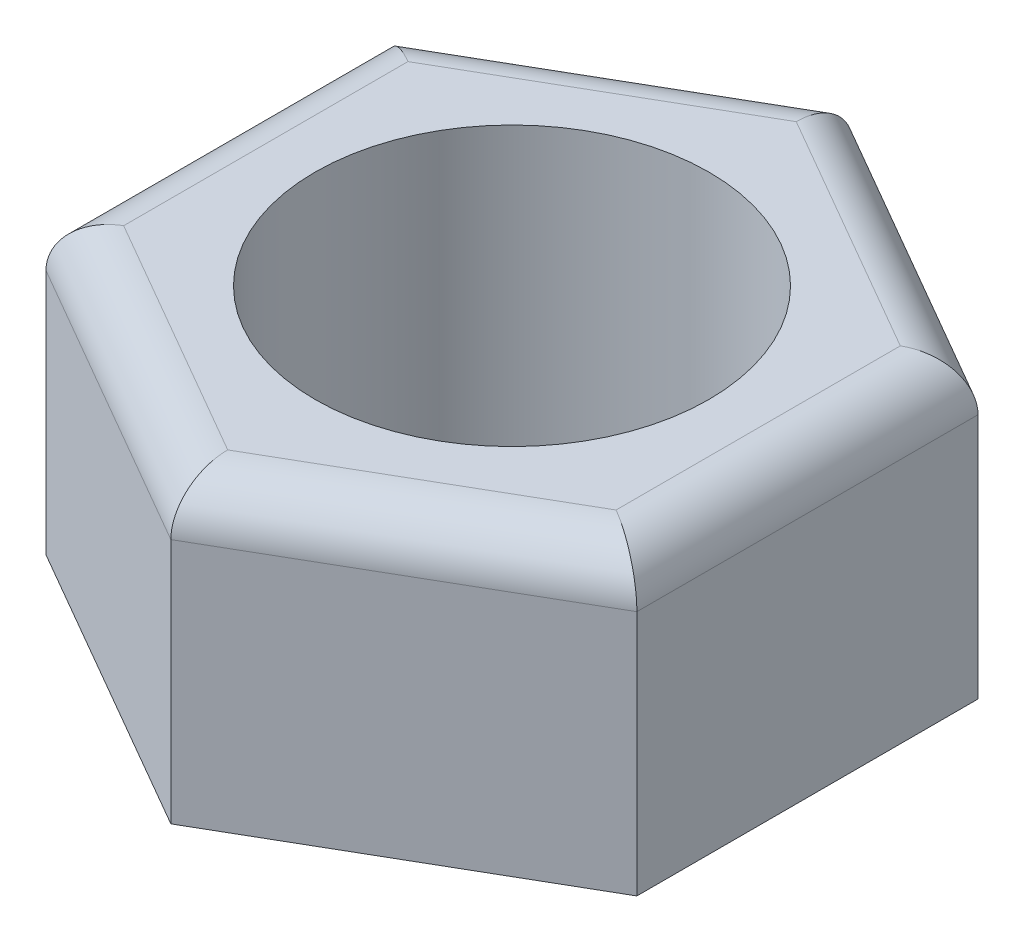
ISO-10303-21;
HEADER;
FILE_DESCRIPTION(('STEP AP214'),'2;1');
FILE_NAME('part.step','',(''),(''),'','','');
FILE_SCHEMA(('AUTOMOTIVE_DESIGN { 1 0 10303 214 1 1 1 1 }'));
ENDSEC;
DATA;
#1=APPLICATION_CONTEXT('core data for automotive mechanical design processes');
#2=APPLICATION_PROTOCOL_DEFINITION('international standard','automotive_design',2000,#1);
#3=PRODUCT_CONTEXT('',#1,'mechanical');
#4=PRODUCT('Part','Part','',(#3));
#5=PRODUCT_RELATED_PRODUCT_CATEGORY('part','',(#4));
#6=PRODUCT_DEFINITION_FORMATION('','',#4);
#7=PRODUCT_DEFINITION_CONTEXT('part definition',#1,'design');
#8=PRODUCT_DEFINITION('design','',#6,#7);
#9=PRODUCT_DEFINITION_SHAPE('','',#8);
#10=(LENGTH_UNIT() NAMED_UNIT(*) SI_UNIT(.MILLI.,.METRE.));
#11=(NAMED_UNIT(*) PLANE_ANGLE_UNIT() SI_UNIT($,.RADIAN.));
#12=(NAMED_UNIT(*) SI_UNIT($,.STERADIAN.) SOLID_ANGLE_UNIT());
#13=UNCERTAINTY_MEASURE_WITH_UNIT(LENGTH_MEASURE(1.E-05),#10,'distance_accuracy_value','');
#14=(GEOMETRIC_REPRESENTATION_CONTEXT(3) GLOBAL_UNCERTAINTY_ASSIGNED_CONTEXT((#13)) GLOBAL_UNIT_ASSIGNED_CONTEXT((#10,
#11,#12)) REPRESENTATION_CONTEXT('',''));
#15=CARTESIAN_POINT('',(0.,0.,0.));
#16=DIRECTION('',(0.,0.,1.));
#17=DIRECTION('',(1.,0.,0.));
#18=AXIS2_PLACEMENT_3D('',#15,#16,#17);
#19=CARTESIAN_POINT('',(0.,1.5,0.));
#20=DIRECTION('',(0.,1.,0.));
#21=DIRECTION('',(0.,0.,1.));
#22=AXIS2_PLACEMENT_3D('',#19,#20,#21);
#23=PLANE('',#22);
#24=DIRECTION('',(0.,0.,-1.));
#25=VECTOR('',#24,1.);
#26=CARTESIAN_POINT('',(1.25,1.5,-0.866025403784439));
#27=LINE('',#26,#25);
#28=CARTESIAN_POINT('',(1.25,1.5,0.721687836487032));
#29=VERTEX_POINT('',#28);
#30=CARTESIAN_POINT('',(1.25,1.5,-0.721687836487033));
#31=VERTEX_POINT('',#30);
#32=EDGE_CURVE('E132',#29,#31,#27,.T.);
#33=ORIENTED_EDGE('',*,*,#32,.T.);
#34=DIRECTION('',(-0.866025403784439,0.,-0.5));
#35=VECTOR('',#34,1.);
#36=CARTESIAN_POINT('',(-0.125000000000001,1.5,-1.51554445662277));
#37=LINE('',#36,#35);
#38=CARTESIAN_POINT('',(0.,1.5,-1.44337567297406));
#39=VERTEX_POINT('',#38);
#40=EDGE_CURVE('E198',#31,#39,#37,.T.);
#41=ORIENTED_EDGE('',*,*,#40,.T.);
#42=DIRECTION('',(-0.866025403784439,0.,0.5));
#43=VECTOR('',#42,1.);
#44=CARTESIAN_POINT('',(-1.375,1.5,-0.649519052838329));
#45=LINE('',#44,#43);
#46=CARTESIAN_POINT('',(-1.25,1.5,-0.721687836487032));
#47=VERTEX_POINT('',#46);
#48=EDGE_CURVE('E195',#39,#47,#45,.T.);
#49=ORIENTED_EDGE('',*,*,#48,.T.);
#50=DIRECTION('',(0.,0.,1.));
#51=VECTOR('',#50,1.);
#52=CARTESIAN_POINT('',(-1.25,1.5,0.866025403784439));
#53=LINE('',#52,#51);
#54=CARTESIAN_POINT('',(-1.25,1.5,0.721687836487033));
#55=VERTEX_POINT('',#54);
#56=EDGE_CURVE('E192',#47,#55,#53,.T.);
#57=ORIENTED_EDGE('',*,*,#56,.T.);
#58=DIRECTION('',(0.866025403784439,0.,0.5));
#59=VECTOR('',#58,1.);
#60=CARTESIAN_POINT('',(0.125,1.5,1.51554445662277));
#61=LINE('',#60,#59);
#62=CARTESIAN_POINT('',(0.,1.5,1.44337567297406));
#63=VERTEX_POINT('',#62);
#64=EDGE_CURVE('E189',#55,#63,#61,.T.);
#65=ORIENTED_EDGE('',*,*,#64,.T.);
#66=DIRECTION('',(0.866025403784439,0.,-0.5));
#67=VECTOR('',#66,1.);
#68=CARTESIAN_POINT('',(1.375,1.5,0.649519052838329));
#69=LINE('',#68,#67);
#70=EDGE_CURVE('E186',#63,#29,#69,.T.);
#71=ORIENTED_EDGE('',*,*,#70,.T.);
#72=EDGE_LOOP('',(#33,#41,#49,#57,#65,#71));
#73=FACE_BOUND('',#72,.T.);
#74=CARTESIAN_POINT('',(0.,1.5,0.));
#75=DIRECTION('',(0.,1.,0.));
#76=DIRECTION('',(0.,0.,1.));
#77=AXIS2_PLACEMENT_3D('',#74,#75,#76);
#78=CIRCLE('',#77,1.);
#79=CARTESIAN_POINT('',(0.,1.5,1.));
#80=VERTEX_POINT('',#79);
#81=EDGE_CURVE('E150',#80,#80,#78,.T.);
#82=ORIENTED_EDGE('',*,*,#81,.F.);
#83=EDGE_LOOP('',(#82));
#84=FACE_BOUND('',#83,.T.);
#85=ADVANCED_FACE('F47',(#73,#84),#23,.T.);
#86=CARTESIAN_POINT('',(0.,0.,0.));
#87=DIRECTION('',(0.,1.,0.));
#88=DIRECTION('',(0.,0.,1.));
#89=AXIS2_PLACEMENT_3D('',#86,#87,#88);
#90=PLANE('',#89);
#91=DIRECTION('',(-0.866025403784439,0.,-0.5));
#92=VECTOR('',#91,1.);
#93=CARTESIAN_POINT('',(1.5,0.,-0.86602540378444));
#94=LINE('',#93,#92);
#95=CARTESIAN_POINT('',(1.5,0.,-0.86602540378444));
#96=VERTEX_POINT('',#95);
#97=CARTESIAN_POINT('',(0.,0.,-1.73205080756888));
#98=VERTEX_POINT('',#97);
#99=EDGE_CURVE('E140',#96,#98,#94,.T.);
#100=ORIENTED_EDGE('',*,*,#99,.F.);
#101=DIRECTION('',(0.,0.,-1.));
#102=VECTOR('',#101,1.);
#103=CARTESIAN_POINT('',(1.5,0.,0.866025403784439));
#104=LINE('',#103,#102);
#105=CARTESIAN_POINT('',(1.5,0.,0.866025403784439));
#106=VERTEX_POINT('',#105);
#107=EDGE_CURVE('E168',#106,#96,#104,.T.);
#108=ORIENTED_EDGE('',*,*,#107,.F.);
#109=DIRECTION('',(0.866025403784439,0.,-0.5));
#110=VECTOR('',#109,1.);
#111=CARTESIAN_POINT('',(0.,0.,1.73205080756888));
#112=LINE('',#111,#110);
#113=CARTESIAN_POINT('',(0.,0.,1.73205080756888));
#114=VERTEX_POINT('',#113);
#115=EDGE_CURVE('E164',#114,#106,#112,.T.);
#116=ORIENTED_EDGE('',*,*,#115,.F.);
#117=DIRECTION('',(0.866025403784439,0.,0.5));
#118=VECTOR('',#117,1.);
#119=CARTESIAN_POINT('',(-1.5,0.,0.866025403784439));
#120=LINE('',#119,#118);
#121=CARTESIAN_POINT('',(-1.5,0.,0.866025403784439));
#122=VERTEX_POINT('',#121);
#123=EDGE_CURVE('E160',#122,#114,#120,.T.);
#124=ORIENTED_EDGE('',*,*,#123,.F.);
#125=DIRECTION('',(0.,0.,1.));
#126=VECTOR('',#125,1.);
#127=CARTESIAN_POINT('',(-1.5,0.,-0.866025403784438));
#128=LINE('',#127,#126);
#129=CARTESIAN_POINT('',(-1.5,0.,-0.866025403784438));
#130=VERTEX_POINT('',#129);
#131=EDGE_CURVE('E143',#130,#122,#128,.T.);
#132=ORIENTED_EDGE('',*,*,#131,.F.);
#133=DIRECTION('',(-0.866025403784438,0.,0.5));
#134=VECTOR('',#133,1.);
#135=CARTESIAN_POINT('',(0.,0.,-1.73205080756888));
#136=LINE('',#135,#134);
#137=EDGE_CURVE('E123',#98,#130,#136,.T.);
#138=ORIENTED_EDGE('',*,*,#137,.F.);
#139=EDGE_LOOP('',(#100,#108,#116,#124,#132,#138));
#140=FACE_BOUND('',#139,.T.);
#141=CARTESIAN_POINT('',(0.,0.,0.));
#142=DIRECTION('',(0.,1.,0.));
#143=DIRECTION('',(0.,0.,1.));
#144=AXIS2_PLACEMENT_3D('',#141,#142,#143);
#145=CIRCLE('',#144,1.);
#146=CARTESIAN_POINT('',(0.,0.,1.));
#147=VERTEX_POINT('',#146);
#148=EDGE_CURVE('E154',#147,#147,#145,.T.);
#149=ORIENTED_EDGE('',*,*,#148,.T.);
#150=EDGE_LOOP('',(#149));
#151=FACE_BOUND('',#150,.T.);
#152=ADVANCED_FACE('F137',(#140,#151),#90,.F.);
#153=CARTESIAN_POINT('',(1.5,1.5,-0.86602540378444));
#154=DIRECTION('',(-0.5,0.,0.866025403784439));
#155=DIRECTION('',(0.866025403784439,0.,0.5));
#156=AXIS2_PLACEMENT_3D('',#153,#154,#155);
#157=PLANE('',#156);
#158=DIRECTION('',(0.,-1.,0.));
#159=VECTOR('',#158,1.);
#160=CARTESIAN_POINT('',(0.,1.5,-1.73205080756888));
#161=LINE('',#160,#159);
#162=CARTESIAN_POINT('',(0.,1.25,-1.73205080756888));
#163=VERTEX_POINT('',#162);
#164=EDGE_CURVE('E119',#163,#98,#161,.T.);
#165=ORIENTED_EDGE('',*,*,#164,.F.);
#166=DIRECTION('',(-0.866025403784439,0.,-0.5));
#167=VECTOR('',#166,1.);
#168=CARTESIAN_POINT('',(1.5,1.25,-0.866025403784439));
#169=LINE('',#168,#167);
#170=CARTESIAN_POINT('',(1.5,1.25,-0.86602540378444));
#171=VERTEX_POINT('',#170);
#172=EDGE_CURVE('E202',#163,#171,#169,.F.);
#173=ORIENTED_EDGE('',*,*,#172,.T.);
#174=DIRECTION('',(0.,-1.,0.));
#175=VECTOR('',#174,1.);
#176=CARTESIAN_POINT('',(1.5,1.5,-0.86602540378444));
#177=LINE('',#176,#175);
#178=EDGE_CURVE('E147',#171,#96,#177,.T.);
#179=ORIENTED_EDGE('',*,*,#178,.T.);
#180=ORIENTED_EDGE('',*,*,#99,.T.);
#181=EDGE_LOOP('',(#165,#173,#179,#180));
#182=FACE_BOUND('',#181,.T.);
#183=ADVANCED_FACE('F146',(#182),#157,.F.);
#184=CARTESIAN_POINT('',(0.,1.5,-1.73205080756888));
#185=DIRECTION('',(0.5,0.,0.866025403784439));
#186=DIRECTION('',(0.866025403784439,0.,-0.5));
#187=AXIS2_PLACEMENT_3D('',#184,#185,#186);
#188=PLANE('',#187);
#189=DIRECTION('',(0.,-1.,0.));
#190=VECTOR('',#189,1.);
#191=CARTESIAN_POINT('',(-1.5,1.5,-0.866025403784438));
#192=LINE('',#191,#190);
#193=CARTESIAN_POINT('',(-1.5,1.25,-0.866025403784438));
#194=VERTEX_POINT('',#193);
#195=EDGE_CURVE('E133',#194,#130,#192,.T.);
#196=ORIENTED_EDGE('',*,*,#195,.F.);
#197=DIRECTION('',(-0.866025403784439,0.,0.5));
#198=VECTOR('',#197,1.);
#199=CARTESIAN_POINT('',(0.,1.25,-1.73205080756888));
#200=LINE('',#199,#198);
#201=EDGE_CURVE('E126',#194,#163,#200,.F.);
#202=ORIENTED_EDGE('',*,*,#201,.T.);
#203=ORIENTED_EDGE('',*,*,#164,.T.);
#204=ORIENTED_EDGE('',*,*,#137,.T.);
#205=EDGE_LOOP('',(#196,#202,#203,#204));
#206=FACE_BOUND('',#205,.T.);
#207=ADVANCED_FACE('F122',(#206),#188,.F.);
#208=CARTESIAN_POINT('',(-1.5,1.5,-0.866025403784438));
#209=DIRECTION('',(1.,0.,0.));
#210=DIRECTION('',(0.,0.,-1.));
#211=AXIS2_PLACEMENT_3D('',#208,#209,#210);
#212=PLANE('',#211);
#213=DIRECTION('',(0.,-1.,0.));
#214=VECTOR('',#213,1.);
#215=CARTESIAN_POINT('',(-1.5,1.5,0.866025403784439));
#216=LINE('',#215,#214);
#217=CARTESIAN_POINT('',(-1.5,1.25,0.866025403784439));
#218=VERTEX_POINT('',#217);
#219=EDGE_CURVE('E179',#218,#122,#216,.T.);
#220=ORIENTED_EDGE('',*,*,#219,.F.);
#221=DIRECTION('',(0.,0.,1.));
#222=VECTOR('',#221,1.);
#223=CARTESIAN_POINT('',(-1.5,1.25,-0.866025403784438));
#224=LINE('',#223,#222);
#225=EDGE_CURVE('E207',#218,#194,#224,.F.);
#226=ORIENTED_EDGE('',*,*,#225,.T.);
#227=ORIENTED_EDGE('',*,*,#195,.T.);
#228=ORIENTED_EDGE('',*,*,#131,.T.);
#229=EDGE_LOOP('',(#220,#226,#227,#228));
#230=FACE_BOUND('',#229,.T.);
#231=ADVANCED_FACE('F272',(#230),#212,.F.);
#232=CARTESIAN_POINT('',(-1.5,1.5,0.866025403784439));
#233=DIRECTION('',(0.5,0.,-0.866025403784439));
#234=DIRECTION('',(-0.866025403784439,0.,-0.5));
#235=AXIS2_PLACEMENT_3D('',#232,#233,#234);
#236=PLANE('',#235);
#237=DIRECTION('',(0.,-1.,0.));
#238=VECTOR('',#237,1.);
#239=CARTESIAN_POINT('',(0.,1.5,1.73205080756888));
#240=LINE('',#239,#238);
#241=CARTESIAN_POINT('',(0.,1.25,1.73205080756888));
#242=VERTEX_POINT('',#241);
#243=EDGE_CURVE('E176',#242,#114,#240,.T.);
#244=ORIENTED_EDGE('',*,*,#243,.F.);
#245=DIRECTION('',(0.866025403784439,0.,0.5));
#246=VECTOR('',#245,1.);
#247=CARTESIAN_POINT('',(-1.5,1.25,0.866025403784439));
#248=LINE('',#247,#246);
#249=EDGE_CURVE('E210',#242,#218,#248,.F.);
#250=ORIENTED_EDGE('',*,*,#249,.T.);
#251=ORIENTED_EDGE('',*,*,#219,.T.);
#252=ORIENTED_EDGE('',*,*,#123,.T.);
#253=EDGE_LOOP('',(#244,#250,#251,#252));
#254=FACE_BOUND('',#253,.T.);
#255=ADVANCED_FACE('F269',(#254),#236,.F.);
#256=CARTESIAN_POINT('',(0.,1.5,1.73205080756888));
#257=DIRECTION('',(-0.5,0.,-0.866025403784439));
#258=DIRECTION('',(-0.866025403784439,0.,0.5));
#259=AXIS2_PLACEMENT_3D('',#256,#257,#258);
#260=PLANE('',#259);
#261=DIRECTION('',(0.,-1.,0.));
#262=VECTOR('',#261,1.);
#263=CARTESIAN_POINT('',(1.5,1.5,0.866025403784439));
#264=LINE('',#263,#262);
#265=CARTESIAN_POINT('',(1.5,1.25,0.866025403784439));
#266=VERTEX_POINT('',#265);
#267=EDGE_CURVE('E173',#266,#106,#264,.T.);
#268=ORIENTED_EDGE('',*,*,#267,.F.);
#269=DIRECTION('',(0.866025403784439,0.,-0.5));
#270=VECTOR('',#269,1.);
#271=CARTESIAN_POINT('',(0.,1.25,1.73205080756888));
#272=LINE('',#271,#270);
#273=EDGE_CURVE('E57',#266,#242,#272,.F.);
#274=ORIENTED_EDGE('',*,*,#273,.T.);
#275=ORIENTED_EDGE('',*,*,#243,.T.);
#276=ORIENTED_EDGE('',*,*,#115,.T.);
#277=EDGE_LOOP('',(#268,#274,#275,#276));
#278=FACE_BOUND('',#277,.T.);
#279=ADVANCED_FACE('F257',(#278),#260,.F.);
#280=CARTESIAN_POINT('',(1.5,1.5,0.866025403784439));
#281=DIRECTION('',(-1.,0.,0.));
#282=DIRECTION('',(0.,0.,1.));
#283=AXIS2_PLACEMENT_3D('',#280,#281,#282);
#284=PLANE('',#283);
#285=ORIENTED_EDGE('',*,*,#178,.F.);
#286=DIRECTION('',(0.,0.,-1.));
#287=VECTOR('',#286,1.);
#288=CARTESIAN_POINT('',(1.5,1.25,0.866025403784439));
#289=LINE('',#288,#287);
#290=EDGE_CURVE('E11',#171,#266,#289,.F.);
#291=ORIENTED_EDGE('',*,*,#290,.T.);
#292=ORIENTED_EDGE('',*,*,#267,.T.);
#293=ORIENTED_EDGE('',*,*,#107,.T.);
#294=EDGE_LOOP('',(#285,#291,#292,#293));
#295=FACE_BOUND('',#294,.T.);
#296=ADVANCED_FACE('F246',(#295),#284,.F.);
#297=CARTESIAN_POINT('',(0.,1.5,0.));
#298=DIRECTION('',(0.,-1.,0.));
#299=DIRECTION('',(0.,0.,-1.));
#300=AXIS2_PLACEMENT_3D('',#297,#298,#299);
#301=CYLINDRICAL_SURFACE('',#300,1.);
#302=ORIENTED_EDGE('',*,*,#81,.T.);
#303=EDGE_LOOP('',(#302));
#304=FACE_BOUND('',#303,.T.);
#305=ORIENTED_EDGE('',*,*,#148,.F.);
#306=EDGE_LOOP('',(#305));
#307=FACE_BOUND('',#306,.T.);
#308=ADVANCED_FACE('F244',(#304,#307),#301,.F.);
#309=CARTESIAN_POINT('',(-0.625,1.25,1.08253175473055));
#310=DIRECTION('',(-0.866025403784439,0.,-0.5));
#311=DIRECTION('',(-0.5,0.,0.866025403784439));
#312=AXIS2_PLACEMENT_3D('',#309,#310,#311);
#313=CYLINDRICAL_SURFACE('',#312,0.25);
#314=CARTESIAN_POINT('',(-1.25,1.25,0.721687836487033));
#315=DIRECTION('',(-0.5,0.,-0.866025403784438));
#316=DIRECTION('',(-0.866025403784439,0.,0.5));
#317=AXIS2_PLACEMENT_3D('',#314,#315,#316);
#318=ELLIPSE('',#317,0.288675134594813,0.25);
#319=EDGE_CURVE('E228',#218,#55,#318,.T.);
#320=ORIENTED_EDGE('',*,*,#319,.F.);
#321=ORIENTED_EDGE('',*,*,#249,.F.);
#322=CARTESIAN_POINT('',(0.,1.25,1.44337567297406));
#323=DIRECTION('',(-1.,0.,0.));
#324=DIRECTION('',(0.,0.,1.));
#325=AXIS2_PLACEMENT_3D('',#322,#323,#324);
#326=ELLIPSE('',#325,0.288675134594813,0.25);
#327=EDGE_CURVE('E51',#63,#242,#326,.F.);
#328=ORIENTED_EDGE('',*,*,#327,.F.);
#329=ORIENTED_EDGE('',*,*,#64,.F.);
#330=EDGE_LOOP('',(#320,#321,#328,#329));
#331=FACE_BOUND('',#330,.T.);
#332=ADVANCED_FACE('F49',(#331),#313,.T.);
#333=CARTESIAN_POINT('',(0.625,1.25,1.08253175473055));
#334=DIRECTION('',(-0.866025403784439,0.,0.5));
#335=DIRECTION('',(0.5,0.,0.866025403784439));
#336=AXIS2_PLACEMENT_3D('',#333,#334,#335);
#337=CYLINDRICAL_SURFACE('',#336,0.25);
#338=ORIENTED_EDGE('',*,*,#327,.T.);
#339=ORIENTED_EDGE('',*,*,#273,.F.);
#340=CARTESIAN_POINT('',(1.25,1.25,0.721687836487032));
#341=DIRECTION('',(-0.5,0.,0.866025403784439));
#342=DIRECTION('',(0.866025403784439,0.,0.5));
#343=AXIS2_PLACEMENT_3D('',#340,#341,#342);
#344=ELLIPSE('',#343,0.288675134594813,0.25);
#345=EDGE_CURVE('E225',#29,#266,#344,.F.);
#346=ORIENTED_EDGE('',*,*,#345,.F.);
#347=ORIENTED_EDGE('',*,*,#70,.F.);
#348=EDGE_LOOP('',(#338,#339,#346,#347));
#349=FACE_BOUND('',#348,.T.);
#350=ADVANCED_FACE('F254',(#349),#337,.T.);
#351=CARTESIAN_POINT('',(-1.25,1.25,0.));
#352=DIRECTION('',(0.,0.,-1.));
#353=DIRECTION('',(-1.,0.,0.));
#354=AXIS2_PLACEMENT_3D('',#351,#352,#353);
#355=CYLINDRICAL_SURFACE('',#354,0.25);
#356=ORIENTED_EDGE('',*,*,#319,.T.);
#357=ORIENTED_EDGE('',*,*,#56,.F.);
#358=CARTESIAN_POINT('',(-1.25,1.25,-0.721687836487032));
#359=DIRECTION('',(0.5,0.,-0.866025403784439));
#360=DIRECTION('',(-0.866025403784439,0.,-0.5));
#361=AXIS2_PLACEMENT_3D('',#358,#359,#360);
#362=ELLIPSE('',#361,0.288675134594813,0.25);
#363=EDGE_CURVE('E221',#194,#47,#362,.T.);
#364=ORIENTED_EDGE('',*,*,#363,.F.);
#365=ORIENTED_EDGE('',*,*,#225,.F.);
#366=EDGE_LOOP('',(#356,#357,#364,#365));
#367=FACE_BOUND('',#366,.T.);
#368=ADVANCED_FACE('F291',(#367),#355,.T.);
#369=CARTESIAN_POINT('',(1.25,1.25,0.));
#370=DIRECTION('',(0.,0.,1.));
#371=DIRECTION('',(1.,0.,0.));
#372=AXIS2_PLACEMENT_3D('',#369,#370,#371);
#373=CYLINDRICAL_SURFACE('',#372,0.25);
#374=ORIENTED_EDGE('',*,*,#345,.T.);
#375=ORIENTED_EDGE('',*,*,#290,.F.);
#376=CARTESIAN_POINT('',(1.25,1.25,-0.721687836487033));
#377=DIRECTION('',(0.5,0.,0.866025403784438));
#378=DIRECTION('',(-0.866025403784439,0.,0.5));
#379=AXIS2_PLACEMENT_3D('',#376,#377,#378);
#380=ELLIPSE('',#379,0.288675134594813,0.25);
#381=EDGE_CURVE('E218',#31,#171,#380,.F.);
#382=ORIENTED_EDGE('',*,*,#381,.F.);
#383=ORIENTED_EDGE('',*,*,#32,.F.);
#384=EDGE_LOOP('',(#374,#375,#382,#383));
#385=FACE_BOUND('',#384,.T.);
#386=ADVANCED_FACE('F287',(#385),#373,.T.);
#387=CARTESIAN_POINT('',(-0.625,1.25,-1.08253175473055));
#388=DIRECTION('',(0.866025403784439,0.,-0.5));
#389=DIRECTION('',(-0.5,0.,-0.866025403784439));
#390=AXIS2_PLACEMENT_3D('',#387,#388,#389);
#391=CYLINDRICAL_SURFACE('',#390,0.25);
#392=ORIENTED_EDGE('',*,*,#363,.T.);
#393=ORIENTED_EDGE('',*,*,#48,.F.);
#394=CARTESIAN_POINT('',(0.,1.25,-1.44337567297406));
#395=DIRECTION('',(1.,0.,0.));
#396=DIRECTION('',(0.,0.,-1.));
#397=AXIS2_PLACEMENT_3D('',#394,#395,#396);
#398=ELLIPSE('',#397,0.288675134594813,0.25);
#399=EDGE_CURVE('E215',#163,#39,#398,.T.);
#400=ORIENTED_EDGE('',*,*,#399,.F.);
#401=ORIENTED_EDGE('',*,*,#201,.F.);
#402=EDGE_LOOP('',(#392,#393,#400,#401));
#403=FACE_BOUND('',#402,.T.);
#404=ADVANCED_FACE('F283',(#403),#391,.T.);
#405=CARTESIAN_POINT('',(0.625,1.25,-1.08253175473055));
#406=DIRECTION('',(0.866025403784439,0.,0.5));
#407=DIRECTION('',(0.5,0.,-0.866025403784439));
#408=AXIS2_PLACEMENT_3D('',#405,#406,#407);
#409=CYLINDRICAL_SURFACE('',#408,0.25);
#410=ORIENTED_EDGE('',*,*,#381,.T.);
#411=ORIENTED_EDGE('',*,*,#172,.F.);
#412=ORIENTED_EDGE('',*,*,#399,.T.);
#413=ORIENTED_EDGE('',*,*,#40,.F.);
#414=EDGE_LOOP('',(#410,#411,#412,#413));
#415=FACE_BOUND('',#414,.T.);
#416=ADVANCED_FACE('F280',(#415),#409,.T.);
#417=CLOSED_SHELL('',(#85,#152,#183,#207,#231,#255,#279,#296,#308,#332,#350,#368,#386,#404,#416));
#418=MANIFOLD_SOLID_BREP('B2',#417);
#419=ADVANCED_BREP_SHAPE_REPRESENTATION('',(#18,#418),#14);
#420=SHAPE_DEFINITION_REPRESENTATION(#9,#419);
ENDSEC;
END-ISO-10303-21;
